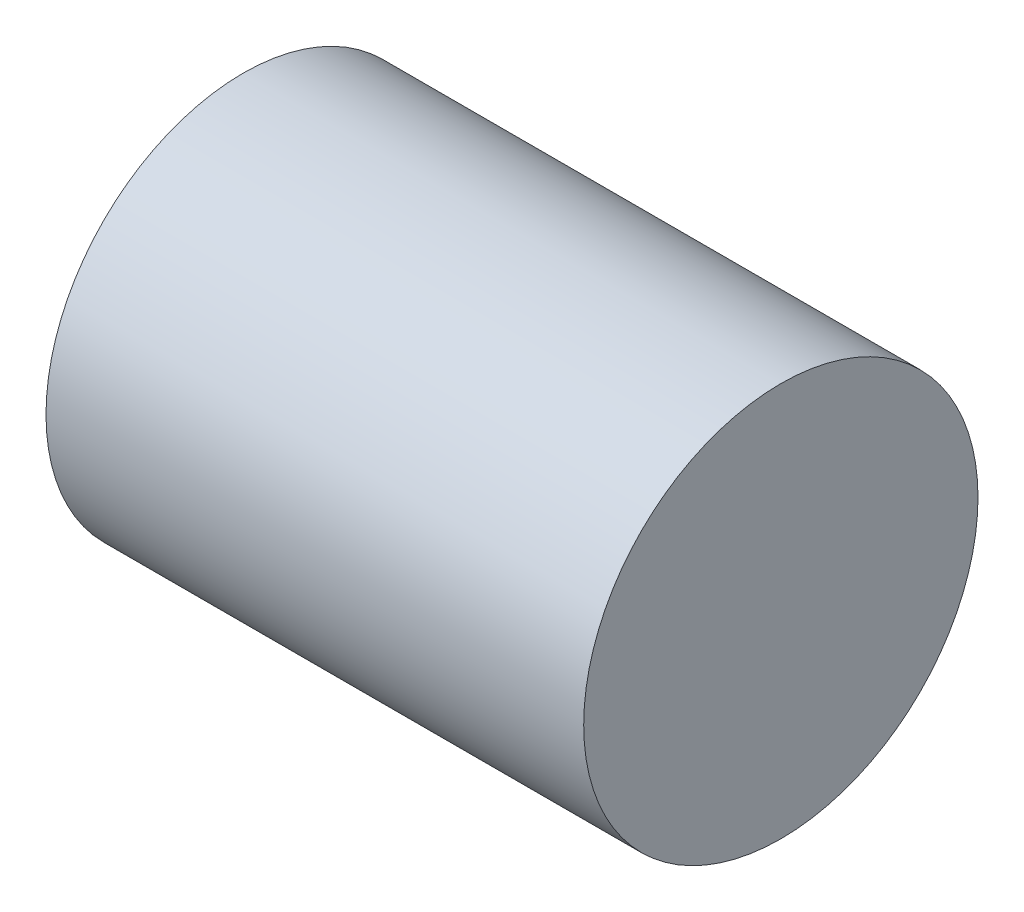
ISO-10303-21;
HEADER;
FILE_DESCRIPTION(('STEP AP214'),'2;1');
FILE_NAME('part.step','',(''),(''),'','','');
FILE_SCHEMA(('AUTOMOTIVE_DESIGN { 1 0 10303 214 1 1 1 1 }'));
ENDSEC;
DATA;
#1=APPLICATION_CONTEXT('core data for automotive mechanical design processes');
#2=APPLICATION_PROTOCOL_DEFINITION('international standard','automotive_design',2000,#1);
#3=PRODUCT_CONTEXT('',#1,'mechanical');
#4=PRODUCT('Part','Part','',(#3));
#5=PRODUCT_RELATED_PRODUCT_CATEGORY('part','',(#4));
#6=PRODUCT_DEFINITION_FORMATION('','',#4);
#7=PRODUCT_DEFINITION_CONTEXT('part definition',#1,'design');
#8=PRODUCT_DEFINITION('design','',#6,#7);
#9=PRODUCT_DEFINITION_SHAPE('','',#8);
#10=(LENGTH_UNIT() NAMED_UNIT(*) SI_UNIT(.MILLI.,.METRE.));
#11=(NAMED_UNIT(*) PLANE_ANGLE_UNIT() SI_UNIT($,.RADIAN.));
#12=(NAMED_UNIT(*) SI_UNIT($,.STERADIAN.) SOLID_ANGLE_UNIT());
#13=UNCERTAINTY_MEASURE_WITH_UNIT(LENGTH_MEASURE(1.E-05),#10,'distance_accuracy_value','');
#14=(GEOMETRIC_REPRESENTATION_CONTEXT(3) GLOBAL_UNCERTAINTY_ASSIGNED_CONTEXT((#13)) GLOBAL_UNIT_ASSIGNED_CONTEXT((#10,
#11,#12)) REPRESENTATION_CONTEXT('',''));
#15=CARTESIAN_POINT('',(0.,0.,0.));
#16=DIRECTION('',(0.,0.,1.));
#17=DIRECTION('',(1.,0.,0.));
#18=AXIS2_PLACEMENT_3D('',#15,#16,#17);
#19=CARTESIAN_POINT('',(15.,0.,0.));
#20=DIRECTION('',(-1.,0.,0.));
#21=DIRECTION('',(0.,0.,1.));
#22=AXIS2_PLACEMENT_3D('',#19,#20,#21);
#23=CYLINDRICAL_SURFACE('',#22,5.5);
#24=CARTESIAN_POINT('',(15.,0.,0.));
#25=DIRECTION('',(1.,0.,0.));
#26=DIRECTION('',(0.,0.,-1.));
#27=AXIS2_PLACEMENT_3D('',#24,#25,#26);
#28=CIRCLE('',#27,5.5);
#29=CARTESIAN_POINT('',(15.,0.,-5.5));
#30=VERTEX_POINT('',#29);
#31=EDGE_CURVE('E10',#30,#30,#28,.T.);
#32=ORIENTED_EDGE('',*,*,#31,.F.);
#33=EDGE_LOOP('',(#32));
#34=FACE_BOUND('',#33,.T.);
#35=CARTESIAN_POINT('',(0.,0.,0.));
#36=DIRECTION('',(1.,0.,0.));
#37=DIRECTION('',(0.,0.,-1.));
#38=AXIS2_PLACEMENT_3D('',#35,#36,#37);
#39=CIRCLE('',#38,5.5);
#40=CARTESIAN_POINT('',(0.,0.,-5.5));
#41=VERTEX_POINT('',#40);
#42=EDGE_CURVE('E46',#41,#41,#39,.T.);
#43=ORIENTED_EDGE('',*,*,#42,.T.);
#44=EDGE_LOOP('',(#43));
#45=FACE_BOUND('',#44,.T.);
#46=ADVANCED_FACE('F43',(#34,#45),#23,.T.);
#47=CARTESIAN_POINT('',(15.,0.,0.));
#48=DIRECTION('',(1.,0.,0.));
#49=DIRECTION('',(0.,0.,-1.));
#50=AXIS2_PLACEMENT_3D('',#47,#48,#49);
#51=PLANE('',#50);
#52=ORIENTED_EDGE('',*,*,#31,.T.);
#53=EDGE_LOOP('',(#52));
#54=FACE_BOUND('',#53,.T.);
#55=ADVANCED_FACE('F60',(#54),#51,.T.);
#56=CARTESIAN_POINT('',(0.,0.,0.));
#57=DIRECTION('',(1.,0.,0.));
#58=DIRECTION('',(0.,0.,-1.));
#59=AXIS2_PLACEMENT_3D('',#56,#57,#58);
#60=PLANE('',#59);
#61=ORIENTED_EDGE('',*,*,#42,.F.);
#62=EDGE_LOOP('',(#61));
#63=FACE_BOUND('',#62,.T.);
#64=ADVANCED_FACE('F58',(#63),#60,.F.);
#65=CLOSED_SHELL('',(#46,#55,#64));
#66=MANIFOLD_SOLID_BREP('B2',#65);
#67=ADVANCED_BREP_SHAPE_REPRESENTATION('',(#18,#66),#14);
#68=SHAPE_DEFINITION_REPRESENTATION(#9,#67);
ENDSEC;
END-ISO-10303-21;
